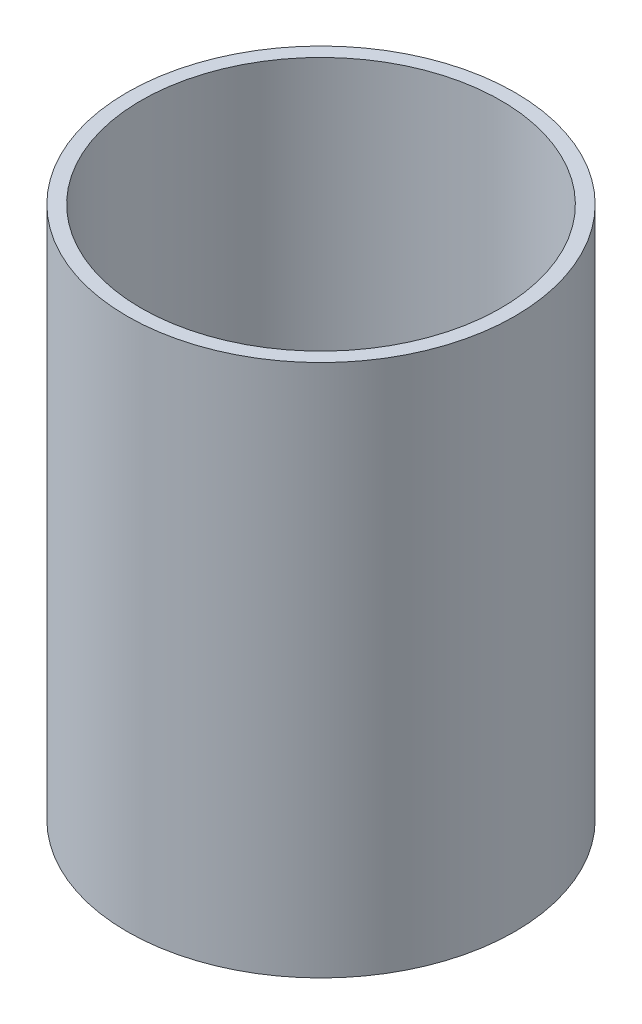
ISO-10303-21;
HEADER;
FILE_DESCRIPTION(('STEP AP214'),'2;1');
FILE_NAME('part.step','',(''),(''),'','','');
FILE_SCHEMA(('AUTOMOTIVE_DESIGN { 1 0 10303 214 1 1 1 1 }'));
ENDSEC;
DATA;
#1=APPLICATION_CONTEXT('core data for automotive mechanical design processes');
#2=APPLICATION_PROTOCOL_DEFINITION('international standard','automotive_design',2000,#1);
#3=PRODUCT_CONTEXT('',#1,'mechanical');
#4=PRODUCT('Part','Part','',(#3));
#5=PRODUCT_RELATED_PRODUCT_CATEGORY('part','',(#4));
#6=PRODUCT_DEFINITION_FORMATION('','',#4);
#7=PRODUCT_DEFINITION_CONTEXT('part definition',#1,'design');
#8=PRODUCT_DEFINITION('design','',#6,#7);
#9=PRODUCT_DEFINITION_SHAPE('','',#8);
#10=(LENGTH_UNIT() NAMED_UNIT(*) SI_UNIT(.MILLI.,.METRE.));
#11=(NAMED_UNIT(*) PLANE_ANGLE_UNIT() SI_UNIT($,.RADIAN.));
#12=(NAMED_UNIT(*) SI_UNIT($,.STERADIAN.) SOLID_ANGLE_UNIT());
#13=UNCERTAINTY_MEASURE_WITH_UNIT(LENGTH_MEASURE(1.E-05),#10,'distance_accuracy_value','');
#14=(GEOMETRIC_REPRESENTATION_CONTEXT(3) GLOBAL_UNCERTAINTY_ASSIGNED_CONTEXT((#13)) GLOBAL_UNIT_ASSIGNED_CONTEXT((#10,
#11,#12)) REPRESENTATION_CONTEXT('',''));
#15=CARTESIAN_POINT('',(0.,0.,0.));
#16=DIRECTION('',(0.,0.,1.));
#17=DIRECTION('',(1.,0.,0.));
#18=AXIS2_PLACEMENT_3D('',#15,#16,#17);
#19=CARTESIAN_POINT('',(0.,200.,0.));
#20=DIRECTION('',(0.,-1.,0.));
#21=DIRECTION('',(0.,0.,-1.));
#22=AXIS2_PLACEMENT_3D('',#19,#20,#21);
#23=CYLINDRICAL_SURFACE('',#22,67.5);
#24=CARTESIAN_POINT('',(0.,2.,0.));
#25=DIRECTION('',(0.,1.,0.));
#26=DIRECTION('',(0.,0.,1.));
#27=AXIS2_PLACEMENT_3D('',#24,#25,#26);
#28=CIRCLE('',#27,67.5);
#29=CARTESIAN_POINT('',(0.,2.,67.5));
#30=VERTEX_POINT('',#29);
#31=EDGE_CURVE('E10',#30,#30,#28,.T.);
#32=ORIENTED_EDGE('',*,*,#31,.F.);
#33=EDGE_LOOP('',(#32));
#34=FACE_BOUND('',#33,.T.);
#35=CARTESIAN_POINT('',(0.,200.,0.));
#36=DIRECTION('',(0.,1.,0.));
#37=DIRECTION('',(0.,0.,1.));
#38=AXIS2_PLACEMENT_3D('',#35,#36,#37);
#39=CIRCLE('',#38,67.5);
#40=CARTESIAN_POINT('',(0.,200.,67.5));
#41=VERTEX_POINT('',#40);
#42=EDGE_CURVE('E40',#41,#41,#39,.T.);
#43=ORIENTED_EDGE('',*,*,#42,.T.);
#44=EDGE_LOOP('',(#43));
#45=FACE_BOUND('',#44,.T.);
#46=ADVANCED_FACE('F30',(#34,#45),#23,.F.);
#47=CARTESIAN_POINT('',(0.,200.,0.));
#48=DIRECTION('',(0.,-1.,0.));
#49=DIRECTION('',(0.,0.,-1.));
#50=AXIS2_PLACEMENT_3D('',#47,#48,#49);
#51=CYLINDRICAL_SURFACE('',#50,72.75);
#52=CARTESIAN_POINT('',(0.,200.,0.));
#53=DIRECTION('',(0.,1.,0.));
#54=DIRECTION('',(0.,0.,1.));
#55=AXIS2_PLACEMENT_3D('',#52,#53,#54);
#56=CIRCLE('',#55,72.75);
#57=CARTESIAN_POINT('',(0.,200.,72.75));
#58=VERTEX_POINT('',#57);
#59=EDGE_CURVE('E36',#58,#58,#56,.T.);
#60=ORIENTED_EDGE('',*,*,#59,.F.);
#61=EDGE_LOOP('',(#60));
#62=FACE_BOUND('',#61,.T.);
#63=CARTESIAN_POINT('',(0.,0.,0.));
#64=DIRECTION('',(0.,1.,0.));
#65=DIRECTION('',(0.,0.,1.));
#66=AXIS2_PLACEMENT_3D('',#63,#64,#65);
#67=CIRCLE('',#66,72.75);
#68=CARTESIAN_POINT('',(0.,0.,72.75));
#69=VERTEX_POINT('',#68);
#70=EDGE_CURVE('E45',#69,#69,#67,.T.);
#71=ORIENTED_EDGE('',*,*,#70,.T.);
#72=EDGE_LOOP('',(#71));
#73=FACE_BOUND('',#72,.T.);
#74=ADVANCED_FACE('F50',(#62,#73),#51,.T.);
#75=CARTESIAN_POINT('',(0.,200.,0.));
#76=DIRECTION('',(0.,1.,0.));
#77=DIRECTION('',(0.,0.,1.));
#78=AXIS2_PLACEMENT_3D('',#75,#76,#77);
#79=PLANE('',#78);
#80=ORIENTED_EDGE('',*,*,#42,.F.);
#81=EDGE_LOOP('',(#80));
#82=FACE_BOUND('',#81,.T.);
#83=ORIENTED_EDGE('',*,*,#59,.T.);
#84=EDGE_LOOP('',(#83));
#85=FACE_BOUND('',#84,.T.);
#86=ADVANCED_FACE('F55',(#82,#85),#79,.T.);
#87=CARTESIAN_POINT('',(0.,0.,0.));
#88=DIRECTION('',(0.,1.,0.));
#89=DIRECTION('',(0.,0.,1.));
#90=AXIS2_PLACEMENT_3D('',#87,#88,#89);
#91=PLANE('',#90);
#92=ORIENTED_EDGE('',*,*,#70,.F.);
#93=EDGE_LOOP('',(#92));
#94=FACE_BOUND('',#93,.T.);
#95=ADVANCED_FACE('F52',(#94),#91,.F.);
#96=CARTESIAN_POINT('',(0.,2.,0.));
#97=DIRECTION('',(0.,1.,0.));
#98=DIRECTION('',(0.,0.,1.));
#99=AXIS2_PLACEMENT_3D('',#96,#97,#98);
#100=PLANE('',#99);
#101=ORIENTED_EDGE('',*,*,#31,.T.);
#102=EDGE_LOOP('',(#101));
#103=FACE_BOUND('',#102,.T.);
#104=ADVANCED_FACE('F54',(#103),#100,.T.);
#105=CLOSED_SHELL('',(#46,#74,#86,#95,#104));
#106=MANIFOLD_SOLID_BREP('B2',#105);
#107=ADVANCED_BREP_SHAPE_REPRESENTATION('',(#18,#106),#14);
#108=SHAPE_DEFINITION_REPRESENTATION(#9,#107);
ENDSEC;
END-ISO-10303-21;
